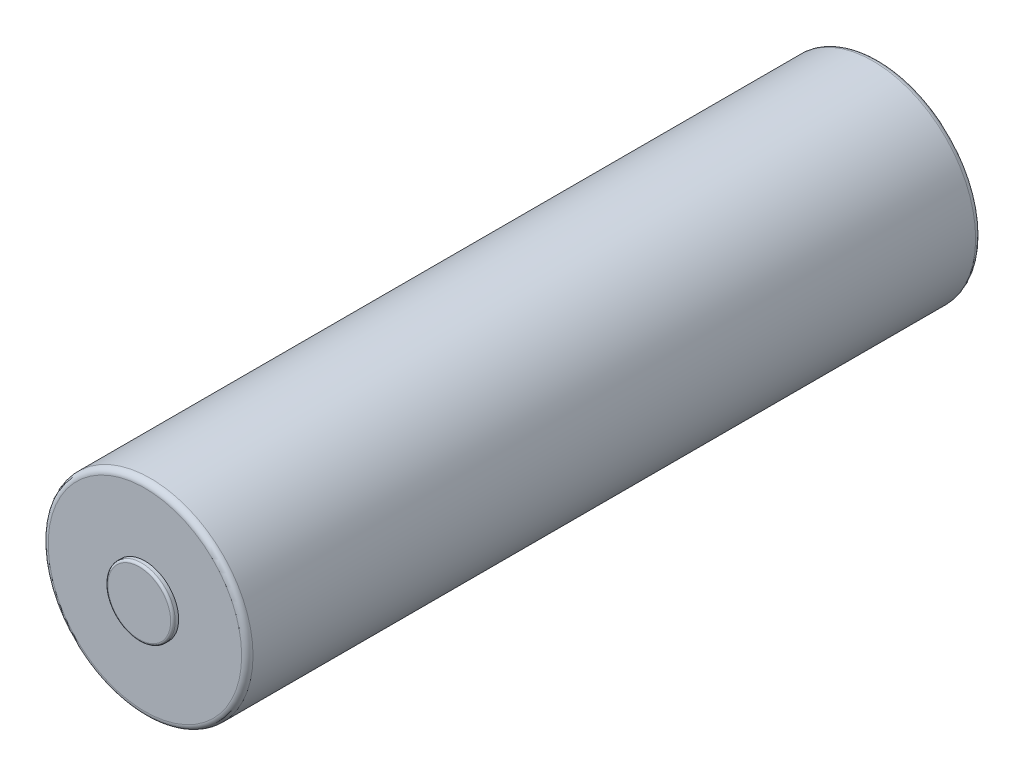
ISO-10303-21;
HEADER;
FILE_DESCRIPTION(('STEP AP214'),'2;1');
FILE_NAME('part.step','',(''),(''),'','','');
FILE_SCHEMA(('AUTOMOTIVE_DESIGN { 1 0 10303 214 1 1 1 1 }'));
ENDSEC;
DATA;
#1=APPLICATION_CONTEXT('core data for automotive mechanical design processes');
#2=APPLICATION_PROTOCOL_DEFINITION('international standard','automotive_design',2000,#1);
#3=PRODUCT_CONTEXT('',#1,'mechanical');
#4=PRODUCT('Part','Part','',(#3));
#5=PRODUCT_RELATED_PRODUCT_CATEGORY('part','',(#4));
#6=PRODUCT_DEFINITION_FORMATION('','',#4);
#7=PRODUCT_DEFINITION_CONTEXT('part definition',#1,'design');
#8=PRODUCT_DEFINITION('design','',#6,#7);
#9=PRODUCT_DEFINITION_SHAPE('','',#8);
#10=(LENGTH_UNIT() NAMED_UNIT(*) SI_UNIT(.MILLI.,.METRE.));
#11=(NAMED_UNIT(*) PLANE_ANGLE_UNIT() SI_UNIT($,.RADIAN.));
#12=(NAMED_UNIT(*) SI_UNIT($,.STERADIAN.) SOLID_ANGLE_UNIT());
#13=UNCERTAINTY_MEASURE_WITH_UNIT(LENGTH_MEASURE(1.E-05),#10,'distance_accuracy_value','');
#14=(GEOMETRIC_REPRESENTATION_CONTEXT(3) GLOBAL_UNCERTAINTY_ASSIGNED_CONTEXT((#13)) GLOBAL_UNIT_ASSIGNED_CONTEXT((#10,
#11,#12)) REPRESENTATION_CONTEXT('',''));
#15=CARTESIAN_POINT('',(0.,0.,0.));
#16=DIRECTION('',(0.,0.,1.));
#17=DIRECTION('',(1.,0.,0.));
#18=AXIS2_PLACEMENT_3D('',#15,#16,#17);
#19=CARTESIAN_POINT('',(0.,0.,64.5));
#20=DIRECTION('',(0.,0.,-1.));
#21=DIRECTION('',(-1.,0.,0.));
#22=AXIS2_PLACEMENT_3D('',#19,#20,#21);
#23=CYLINDRICAL_SURFACE('',#22,9.);
#24=CARTESIAN_POINT('',(0.,0.,0.5));
#25=DIRECTION('',(0.,0.,1.));
#26=DIRECTION('',(1.,0.,0.));
#27=AXIS2_PLACEMENT_3D('',#24,#25,#26);
#28=CIRCLE('',#27,9.);
#29=CARTESIAN_POINT('',(9.,0.,0.5));
#30=VERTEX_POINT('',#29);
#31=EDGE_CURVE('E52',#30,#30,#28,.T.);
#32=ORIENTED_EDGE('',*,*,#31,.T.);
#33=EDGE_LOOP('',(#32));
#34=FACE_BOUND('',#33,.T.);
#35=CARTESIAN_POINT('',(0.,0.,64.));
#36=DIRECTION('',(0.,0.,1.));
#37=DIRECTION('',(1.,0.,0.));
#38=AXIS2_PLACEMENT_3D('',#35,#36,#37);
#39=CIRCLE('',#38,9.);
#40=CARTESIAN_POINT('',(9.,0.,64.));
#41=VERTEX_POINT('',#40);
#42=EDGE_CURVE('E55',#41,#41,#39,.F.);
#43=ORIENTED_EDGE('',*,*,#42,.T.);
#44=EDGE_LOOP('',(#43));
#45=FACE_BOUND('',#44,.T.);
#46=ADVANCED_FACE('F32',(#34,#45),#23,.T.);
#47=CARTESIAN_POINT('',(0.,0.,64.5));
#48=DIRECTION('',(0.,0.,1.));
#49=DIRECTION('',(1.,0.,0.));
#50=AXIS2_PLACEMENT_3D('',#47,#48,#49);
#51=PLANE('',#50);
#52=CARTESIAN_POINT('',(0.,0.,64.5));
#53=DIRECTION('',(0.,0.,1.));
#54=DIRECTION('',(1.,0.,0.));
#55=AXIS2_PLACEMENT_3D('',#52,#53,#54);
#56=CIRCLE('',#55,2.96216218803761);
#57=CARTESIAN_POINT('',(2.96216218803761,0.,64.5));
#58=VERTEX_POINT('',#57);
#59=EDGE_CURVE('E58',#58,#58,#56,.T.);
#60=ORIENTED_EDGE('',*,*,#59,.F.);
#61=EDGE_LOOP('',(#60));
#62=FACE_BOUND('',#61,.T.);
#63=CARTESIAN_POINT('',(0.,0.,64.5));
#64=DIRECTION('',(0.,0.,1.));
#65=DIRECTION('',(1.,0.,0.));
#66=AXIS2_PLACEMENT_3D('',#63,#64,#65);
#67=CIRCLE('',#66,8.5);
#68=CARTESIAN_POINT('',(8.5,0.,64.5));
#69=VERTEX_POINT('',#68);
#70=EDGE_CURVE('E43',#69,#69,#67,.T.);
#71=ORIENTED_EDGE('',*,*,#70,.T.);
#72=EDGE_LOOP('',(#71));
#73=FACE_BOUND('',#72,.T.);
#74=ADVANCED_FACE('F64',(#62,#73),#51,.T.);
#75=CARTESIAN_POINT('',(0.,0.,0.));
#76=DIRECTION('',(0.,0.,1.));
#77=DIRECTION('',(1.,0.,0.));
#78=AXIS2_PLACEMENT_3D('',#75,#76,#77);
#79=PLANE('',#78);
#80=CARTESIAN_POINT('',(0.,0.,0.));
#81=DIRECTION('',(0.,0.,1.));
#82=DIRECTION('',(1.,0.,0.));
#83=AXIS2_PLACEMENT_3D('',#80,#81,#82);
#84=CIRCLE('',#83,8.5);
#85=CARTESIAN_POINT('',(8.5,0.,0.));
#86=VERTEX_POINT('',#85);
#87=EDGE_CURVE('E47',#86,#86,#84,.F.);
#88=ORIENTED_EDGE('',*,*,#87,.T.);
#89=EDGE_LOOP('',(#88));
#90=FACE_BOUND('',#89,.T.);
#91=ADVANCED_FACE('F67',(#90),#79,.F.);
#92=CARTESIAN_POINT('',(0.,0.,0.5));
#93=DIRECTION('',(0.,0.,1.));
#94=DIRECTION('',(1.,0.,0.));
#95=AXIS2_PLACEMENT_3D('',#92,#93,#94);
#96=TOROIDAL_SURFACE('',#95,8.5,0.5);
#97=ORIENTED_EDGE('',*,*,#87,.F.);
#98=EDGE_LOOP('',(#97));
#99=FACE_BOUND('',#98,.T.);
#100=ORIENTED_EDGE('',*,*,#31,.F.);
#101=EDGE_LOOP('',(#100));
#102=FACE_BOUND('',#101,.T.);
#103=ADVANCED_FACE('F73',(#99,#102),#96,.T.);
#104=CARTESIAN_POINT('',(0.,0.,64.));
#105=DIRECTION('',(0.,0.,1.));
#106=DIRECTION('',(1.,0.,0.));
#107=AXIS2_PLACEMENT_3D('',#104,#105,#106);
#108=TOROIDAL_SURFACE('',#107,8.5,0.5);
#109=ORIENTED_EDGE('',*,*,#42,.F.);
#110=EDGE_LOOP('',(#109));
#111=FACE_BOUND('',#110,.T.);
#112=ORIENTED_EDGE('',*,*,#70,.F.);
#113=EDGE_LOOP('',(#112));
#114=FACE_BOUND('',#113,.T.);
#115=ADVANCED_FACE('F71',(#111,#114),#108,.T.);
#116=CARTESIAN_POINT('',(0.,0.,65.));
#117=DIRECTION('',(0.,0.,-1.));
#118=DIRECTION('',(-1.,0.,0.));
#119=AXIS2_PLACEMENT_3D('',#116,#117,#118);
#120=CYLINDRICAL_SURFACE('',#119,2.96216218803761);
#121=CARTESIAN_POINT('',(0.,0.,64.8));
#122=DIRECTION('',(0.,0.,1.));
#123=DIRECTION('',(1.,0.,0.));
#124=AXIS2_PLACEMENT_3D('',#121,#122,#123);
#125=CIRCLE('',#124,2.96216218803761);
#126=CARTESIAN_POINT('',(2.96216218803761,0.,64.8));
#127=VERTEX_POINT('',#126);
#128=EDGE_CURVE('E10',#127,#127,#125,.F.);
#129=ORIENTED_EDGE('',*,*,#128,.T.);
#130=EDGE_LOOP('',(#129));
#131=FACE_BOUND('',#130,.T.);
#132=ORIENTED_EDGE('',*,*,#59,.T.);
#133=EDGE_LOOP('',(#132));
#134=FACE_BOUND('',#133,.T.);
#135=ADVANCED_FACE('F62',(#131,#134),#120,.T.);
#136=CARTESIAN_POINT('',(0.,0.,65.));
#137=DIRECTION('',(0.,0.,1.));
#138=DIRECTION('',(1.,0.,0.));
#139=AXIS2_PLACEMENT_3D('',#136,#137,#138);
#140=PLANE('',#139);
#141=CARTESIAN_POINT('',(0.,0.,65.));
#142=DIRECTION('',(0.,0.,1.));
#143=DIRECTION('',(1.,0.,0.));
#144=AXIS2_PLACEMENT_3D('',#141,#142,#143);
#145=CIRCLE('',#144,2.76216218803761);
#146=CARTESIAN_POINT('',(2.76216218803761,0.,65.));
#147=VERTEX_POINT('',#146);
#148=EDGE_CURVE('E39',#147,#147,#145,.T.);
#149=ORIENTED_EDGE('',*,*,#148,.T.);
#150=EDGE_LOOP('',(#149));
#151=FACE_BOUND('',#150,.T.);
#152=ADVANCED_FACE('F79',(#151),#140,.T.);
#153=CARTESIAN_POINT('',(0.,0.,64.8));
#154=DIRECTION('',(0.,0.,1.));
#155=DIRECTION('',(1.,0.,0.));
#156=AXIS2_PLACEMENT_3D('',#153,#154,#155);
#157=TOROIDAL_SURFACE('',#156,2.76216218803761,0.2);
#158=ORIENTED_EDGE('',*,*,#128,.F.);
#159=EDGE_LOOP('',(#158));
#160=FACE_BOUND('',#159,.T.);
#161=ORIENTED_EDGE('',*,*,#148,.F.);
#162=EDGE_LOOP('',(#161));
#163=FACE_BOUND('',#162,.T.);
#164=ADVANCED_FACE('F34',(#160,#163),#157,.T.);
#165=CLOSED_SHELL('',(#46,#74,#91,#103,#115,#135,#152,#164));
#166=MANIFOLD_SOLID_BREP('B2',#165);
#167=ADVANCED_BREP_SHAPE_REPRESENTATION('',(#18,#166),#14);
#168=SHAPE_DEFINITION_REPRESENTATION(#9,#167);
ENDSEC;
END-ISO-10303-21;
